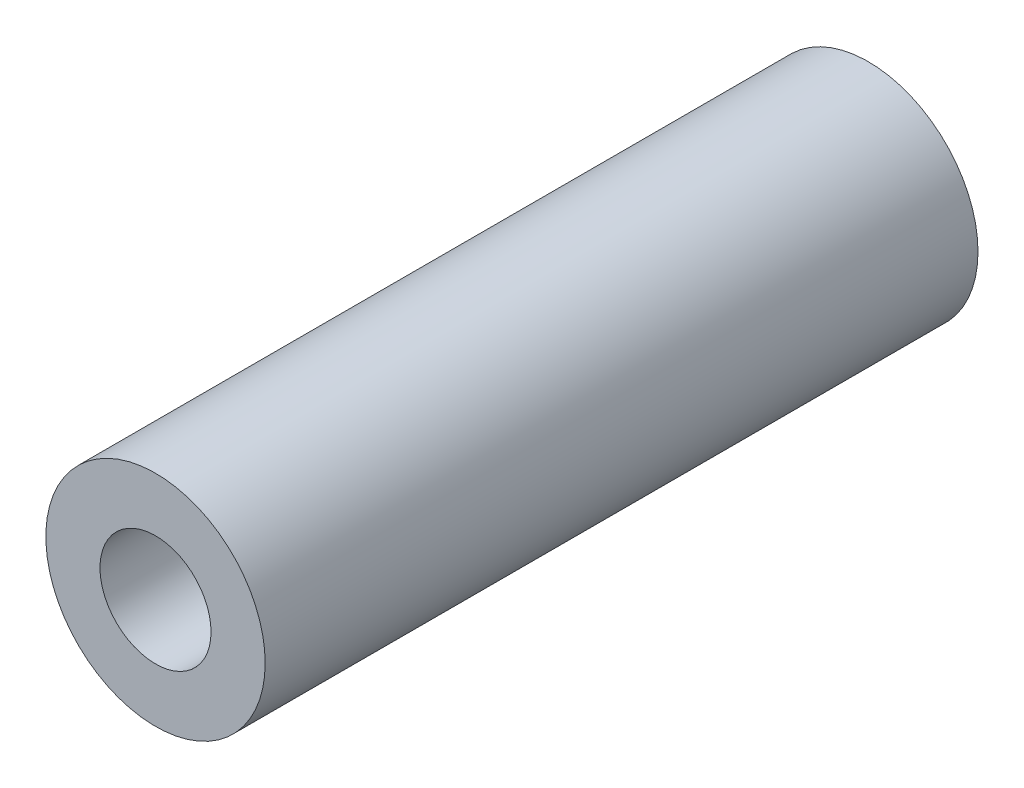
ISO-10303-21;
HEADER;
FILE_DESCRIPTION(('STEP AP214'),'2;1');
FILE_NAME('part.step','',(''),(''),'','','');
FILE_SCHEMA(('AUTOMOTIVE_DESIGN { 1 0 10303 214 1 1 1 1 }'));
ENDSEC;
DATA;
#1=APPLICATION_CONTEXT('core data for automotive mechanical design processes');
#2=APPLICATION_PROTOCOL_DEFINITION('international standard','automotive_design',2000,#1);
#3=PRODUCT_CONTEXT('',#1,'mechanical');
#4=PRODUCT('Part','Part','',(#3));
#5=PRODUCT_RELATED_PRODUCT_CATEGORY('part','',(#4));
#6=PRODUCT_DEFINITION_FORMATION('','',#4);
#7=PRODUCT_DEFINITION_CONTEXT('part definition',#1,'design');
#8=PRODUCT_DEFINITION('design','',#6,#7);
#9=PRODUCT_DEFINITION_SHAPE('','',#8);
#10=(LENGTH_UNIT() NAMED_UNIT(*) SI_UNIT(.MILLI.,.METRE.));
#11=(NAMED_UNIT(*) PLANE_ANGLE_UNIT() SI_UNIT($,.RADIAN.));
#12=(NAMED_UNIT(*) SI_UNIT($,.STERADIAN.) SOLID_ANGLE_UNIT());
#13=UNCERTAINTY_MEASURE_WITH_UNIT(LENGTH_MEASURE(1.E-05),#10,'distance_accuracy_value','');
#14=(GEOMETRIC_REPRESENTATION_CONTEXT(3) GLOBAL_UNCERTAINTY_ASSIGNED_CONTEXT((#13)) GLOBAL_UNIT_ASSIGNED_CONTEXT((#10,
#11,#12)) REPRESENTATION_CONTEXT('',''));
#15=CARTESIAN_POINT('',(0.,0.,0.));
#16=DIRECTION('',(0.,0.,1.));
#17=DIRECTION('',(1.,0.,0.));
#18=AXIS2_PLACEMENT_3D('',#15,#16,#17);
#19=CARTESIAN_POINT('',(0.,0.,52.));
#20=DIRECTION('',(0.,0.,-1.));
#21=DIRECTION('',(-1.,0.,0.));
#22=AXIS2_PLACEMENT_3D('',#19,#20,#21);
#23=CYLINDRICAL_SURFACE('',#22,8.);
#24=CARTESIAN_POINT('',(0.,0.,52.));
#25=DIRECTION('',(0.,0.,1.));
#26=DIRECTION('',(1.,0.,0.));
#27=AXIS2_PLACEMENT_3D('',#24,#25,#26);
#28=CIRCLE('',#27,8.);
#29=CARTESIAN_POINT('',(8.,0.,52.));
#30=VERTEX_POINT('',#29);
#31=EDGE_CURVE('E10',#30,#30,#28,.T.);
#32=ORIENTED_EDGE('',*,*,#31,.F.);
#33=EDGE_LOOP('',(#32));
#34=FACE_BOUND('',#33,.T.);
#35=CARTESIAN_POINT('',(0.,0.,0.));
#36=DIRECTION('',(0.,0.,1.));
#37=DIRECTION('',(1.,0.,0.));
#38=AXIS2_PLACEMENT_3D('',#35,#36,#37);
#39=CIRCLE('',#38,8.);
#40=CARTESIAN_POINT('',(8.,0.,0.));
#41=VERTEX_POINT('',#40);
#42=EDGE_CURVE('E42',#41,#41,#39,.T.);
#43=ORIENTED_EDGE('',*,*,#42,.T.);
#44=EDGE_LOOP('',(#43));
#45=FACE_BOUND('',#44,.T.);
#46=ADVANCED_FACE('F40',(#34,#45),#23,.T.);
#47=CARTESIAN_POINT('',(0.,0.,52.));
#48=DIRECTION('',(0.,0.,1.));
#49=DIRECTION('',(1.,0.,0.));
#50=AXIS2_PLACEMENT_3D('',#47,#48,#49);
#51=PLANE('',#50);
#52=CARTESIAN_POINT('',(0.,0.,52.));
#53=DIRECTION('',(0.,0.,1.));
#54=DIRECTION('',(1.,0.,0.));
#55=AXIS2_PLACEMENT_3D('',#52,#53,#54);
#56=CIRCLE('',#55,4.05);
#57=CARTESIAN_POINT('',(4.05,0.,52.));
#58=VERTEX_POINT('',#57);
#59=EDGE_CURVE('E37',#58,#58,#56,.F.);
#60=ORIENTED_EDGE('',*,*,#59,.T.);
#61=EDGE_LOOP('',(#60));
#62=FACE_BOUND('',#61,.T.);
#63=ORIENTED_EDGE('',*,*,#31,.T.);
#64=EDGE_LOOP('',(#63));
#65=FACE_BOUND('',#64,.T.);
#66=ADVANCED_FACE('F81',(#62,#65),#51,.T.);
#67=CARTESIAN_POINT('',(0.,0.,0.));
#68=DIRECTION('',(0.,0.,1.));
#69=DIRECTION('',(1.,0.,0.));
#70=AXIS2_PLACEMENT_3D('',#67,#68,#69);
#71=PLANE('',#70);
#72=CARTESIAN_POINT('',(0.,0.,0.));
#73=DIRECTION('',(0.,0.,1.));
#74=DIRECTION('',(1.,0.,0.));
#75=AXIS2_PLACEMENT_3D('',#72,#73,#74);
#76=CIRCLE('',#75,4.05);
#77=CARTESIAN_POINT('',(4.05,0.,0.));
#78=VERTEX_POINT('',#77);
#79=EDGE_CURVE('E47',#78,#78,#76,.F.);
#80=ORIENTED_EDGE('',*,*,#79,.F.);
#81=EDGE_LOOP('',(#80));
#82=FACE_BOUND('',#81,.T.);
#83=ORIENTED_EDGE('',*,*,#42,.F.);
#84=EDGE_LOOP('',(#83));
#85=FACE_BOUND('',#84,.T.);
#86=ADVANCED_FACE('F86',(#82,#85),#71,.F.);
#87=CARTESIAN_POINT('',(0.,0.,14.25));
#88=DIRECTION('',(0.,0.,-1.));
#89=DIRECTION('',(-1.,0.,0.));
#90=AXIS2_PLACEMENT_3D('',#87,#88,#89);
#91=CYLINDRICAL_SURFACE('',#90,4.05);
#92=CARTESIAN_POINT('',(0.,0.,14.25));
#93=DIRECTION('',(0.,0.,1.));
#94=DIRECTION('',(1.,0.,0.));
#95=AXIS2_PLACEMENT_3D('',#92,#93,#94);
#96=CIRCLE('',#95,4.05);
#97=CARTESIAN_POINT('',(4.05,0.,14.25));
#98=VERTEX_POINT('',#97);
#99=EDGE_CURVE('E55',#98,#98,#96,.T.);
#100=ORIENTED_EDGE('',*,*,#99,.T.);
#101=EDGE_LOOP('',(#100));
#102=FACE_BOUND('',#101,.T.);
#103=ORIENTED_EDGE('',*,*,#79,.T.);
#104=EDGE_LOOP('',(#103));
#105=FACE_BOUND('',#104,.T.);
#106=ADVANCED_FACE('F78',(#102,#105),#91,.F.);
#107=CARTESIAN_POINT('',(0.,0.,14.25));
#108=DIRECTION('',(0.,0.,1.));
#109=DIRECTION('',(1.,0.,0.));
#110=AXIS2_PLACEMENT_3D('',#107,#108,#109);
#111=PLANE('',#110);
#112=ORIENTED_EDGE('',*,*,#99,.F.);
#113=EDGE_LOOP('',(#112));
#114=FACE_BOUND('',#113,.T.);
#115=ADVANCED_FACE('F72',(#114),#111,.F.);
#116=CARTESIAN_POINT('',(0.,0.,52.1));
#117=DIRECTION('',(0.,0.,-1.));
#118=DIRECTION('',(-1.,0.,0.));
#119=AXIS2_PLACEMENT_3D('',#116,#117,#118);
#120=CYLINDRICAL_SURFACE('',#119,4.05);
#121=ORIENTED_EDGE('',*,*,#59,.F.);
#122=EDGE_LOOP('',(#121));
#123=FACE_BOUND('',#122,.T.);
#124=CARTESIAN_POINT('',(0.,0.,37.75));
#125=DIRECTION('',(0.,0.,1.));
#126=DIRECTION('',(1.,0.,0.));
#127=AXIS2_PLACEMENT_3D('',#124,#125,#126);
#128=CIRCLE('',#127,4.05);
#129=CARTESIAN_POINT('',(4.05,0.,37.75));
#130=VERTEX_POINT('',#129);
#131=EDGE_CURVE('E62',#130,#130,#128,.T.);
#132=ORIENTED_EDGE('',*,*,#131,.F.);
#133=EDGE_LOOP('',(#132));
#134=FACE_BOUND('',#133,.T.);
#135=ADVANCED_FACE('F66',(#123,#134),#120,.F.);
#136=CARTESIAN_POINT('',(0.,0.,37.75));
#137=DIRECTION('',(0.,0.,1.));
#138=DIRECTION('',(1.,0.,0.));
#139=AXIS2_PLACEMENT_3D('',#136,#137,#138);
#140=PLANE('',#139);
#141=ORIENTED_EDGE('',*,*,#131,.T.);
#142=EDGE_LOOP('',(#141));
#143=FACE_BOUND('',#142,.T.);
#144=ADVANCED_FACE('F70',(#143),#140,.T.);
#145=CLOSED_SHELL('',(#46,#66,#86,#106,#115,#135,#144));
#146=MANIFOLD_SOLID_BREP('B2',#145);
#147=ADVANCED_BREP_SHAPE_REPRESENTATION('',(#18,#146),#14);
#148=SHAPE_DEFINITION_REPRESENTATION(#9,#147);
ENDSEC;
END-ISO-10303-21;
